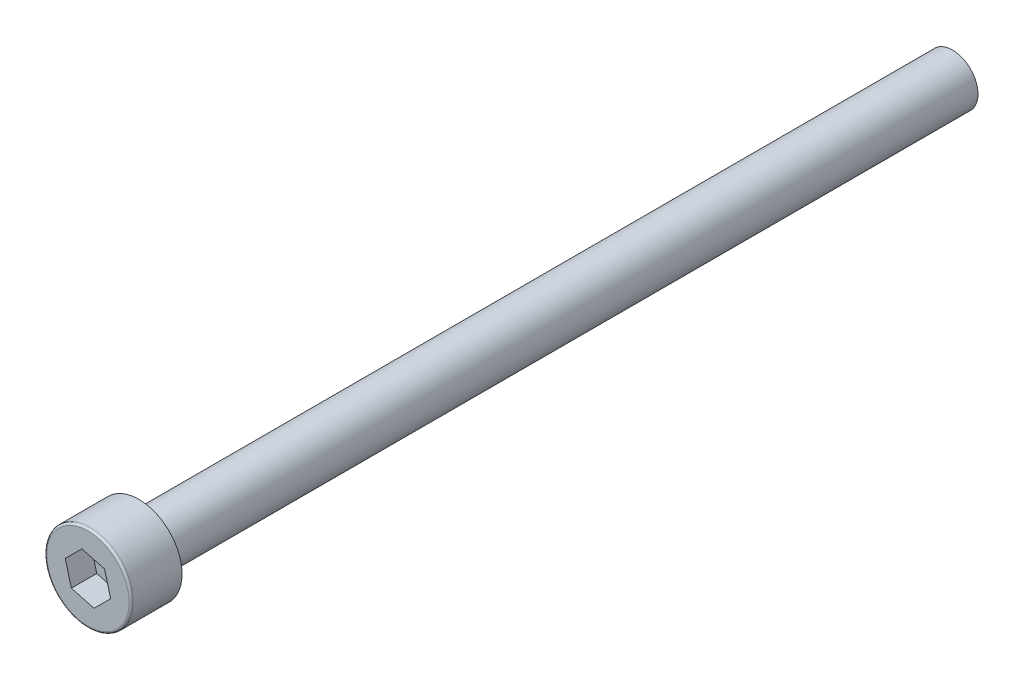
ISO-10303-21;
HEADER;
FILE_DESCRIPTION(('STEP AP214'),'2;1');
FILE_NAME('part.step','',(''),(''),'','','');
FILE_SCHEMA(('AUTOMOTIVE_DESIGN { 1 0 10303 214 1 1 1 1 }'));
ENDSEC;
DATA;
#1=APPLICATION_CONTEXT('core data for automotive mechanical design processes');
#2=APPLICATION_PROTOCOL_DEFINITION('international standard','automotive_design',2000,#1);
#3=PRODUCT_CONTEXT('',#1,'mechanical');
#4=PRODUCT('Part','Part','',(#3));
#5=PRODUCT_RELATED_PRODUCT_CATEGORY('part','',(#4));
#6=PRODUCT_DEFINITION_FORMATION('','',#4);
#7=PRODUCT_DEFINITION_CONTEXT('part definition',#1,'design');
#8=PRODUCT_DEFINITION('design','',#6,#7);
#9=PRODUCT_DEFINITION_SHAPE('','',#8);
#10=(LENGTH_UNIT() NAMED_UNIT(*) SI_UNIT(.MILLI.,.METRE.));
#11=(NAMED_UNIT(*) PLANE_ANGLE_UNIT() SI_UNIT($,.RADIAN.));
#12=(NAMED_UNIT(*) SI_UNIT($,.STERADIAN.) SOLID_ANGLE_UNIT());
#13=UNCERTAINTY_MEASURE_WITH_UNIT(LENGTH_MEASURE(1.E-05),#10,'distance_accuracy_value','');
#14=(GEOMETRIC_REPRESENTATION_CONTEXT(3) GLOBAL_UNCERTAINTY_ASSIGNED_CONTEXT((#13)) GLOBAL_UNIT_ASSIGNED_CONTEXT((#10,
#11,#12)) REPRESENTATION_CONTEXT('',''));
#15=CARTESIAN_POINT('',(0.,0.,0.));
#16=DIRECTION('',(0.,0.,1.));
#17=DIRECTION('',(1.,0.,0.));
#18=AXIS2_PLACEMENT_3D('',#15,#16,#17);
#19=CARTESIAN_POINT('',(0.,0.,0.));
#20=DIRECTION('',(0.,0.,1.));
#21=DIRECTION('',(1.,0.,0.));
#22=AXIS2_PLACEMENT_3D('',#19,#20,#21);
#23=PLANE('',#22);
#24=CARTESIAN_POINT('',(0.,0.,0.));
#25=DIRECTION('',(0.,0.,1.));
#26=DIRECTION('',(1.,0.,0.));
#27=AXIS2_PLACEMENT_3D('',#24,#25,#26);
#28=CIRCLE('',#27,4.25);
#29=CARTESIAN_POINT('',(4.25,0.,0.));
#30=VERTEX_POINT('',#29);
#31=EDGE_CURVE('E140',#30,#30,#28,.T.);
#32=ORIENTED_EDGE('',*,*,#31,.F.);
#33=EDGE_LOOP('',(#32));
#34=FACE_BOUND('',#33,.T.);
#35=CARTESIAN_POINT('',(0.,0.,0.));
#36=DIRECTION('',(0.,0.,1.));
#37=DIRECTION('',(1.,0.,0.));
#38=AXIS2_PLACEMENT_3D('',#35,#36,#37);
#39=CIRCLE('',#38,2.5);
#40=CARTESIAN_POINT('',(2.5,0.,0.));
#41=VERTEX_POINT('',#40);
#42=EDGE_CURVE('E148',#41,#41,#39,.F.);
#43=ORIENTED_EDGE('',*,*,#42,.F.);
#44=EDGE_LOOP('',(#43));
#45=FACE_BOUND('',#44,.T.);
#46=ADVANCED_FACE('F37',(#34,#45),#23,.F.);
#47=CARTESIAN_POINT('',(0.,0.,5.));
#48=DIRECTION('',(0.,0.,-1.));
#49=DIRECTION('',(-1.,0.,0.));
#50=AXIS2_PLACEMENT_3D('',#47,#48,#49);
#51=CYLINDRICAL_SURFACE('',#50,4.25);
#52=CARTESIAN_POINT('',(0.,0.,4.8));
#53=DIRECTION('',(0.,0.,1.));
#54=DIRECTION('',(1.,0.,0.));
#55=AXIS2_PLACEMENT_3D('',#52,#53,#54);
#56=CIRCLE('',#55,4.25);
#57=CARTESIAN_POINT('',(4.25,0.,4.8));
#58=VERTEX_POINT('',#57);
#59=EDGE_CURVE('E11',#58,#58,#56,.F.);
#60=ORIENTED_EDGE('',*,*,#59,.T.);
#61=EDGE_LOOP('',(#60));
#62=FACE_BOUND('',#61,.T.);
#63=ORIENTED_EDGE('',*,*,#31,.T.);
#64=EDGE_LOOP('',(#63));
#65=FACE_BOUND('',#64,.T.);
#66=ADVANCED_FACE('F167',(#62,#65),#51,.T.);
#67=CARTESIAN_POINT('',(0.,0.,5.));
#68=DIRECTION('',(0.,0.,1.));
#69=DIRECTION('',(1.,0.,0.));
#70=AXIS2_PLACEMENT_3D('',#67,#68,#69);
#71=PLANE('',#70);
#72=CARTESIAN_POINT('',(0.,0.,5.));
#73=DIRECTION('',(0.,0.,1.));
#74=DIRECTION('',(1.,0.,0.));
#75=AXIS2_PLACEMENT_3D('',#72,#73,#74);
#76=CIRCLE('',#75,4.05);
#77=CARTESIAN_POINT('',(4.05,0.,5.));
#78=VERTEX_POINT('',#77);
#79=EDGE_CURVE('E45',#78,#78,#76,.T.);
#80=ORIENTED_EDGE('',*,*,#79,.T.);
#81=EDGE_LOOP('',(#80));
#82=FACE_BOUND('',#81,.T.);
#83=DIRECTION('',(0.258819045102521,-0.965925826289068,0.));
#84=VECTOR('',#83,1.);
#85=CARTESIAN_POINT('',(-2.23071014330082,0.597716981445369,5.));
#86=LINE('',#85,#84);
#87=CARTESIAN_POINT('',(-2.23071014330082,0.597716981445369,5.));
#88=VERTEX_POINT('',#87);
#89=CARTESIAN_POINT('',(-1.63299316185545,-1.63299316185545,5.));
#90=VERTEX_POINT('',#89);
#91=EDGE_CURVE('E52',#88,#90,#86,.T.);
#92=ORIENTED_EDGE('',*,*,#91,.F.);
#93=DIRECTION('',(-0.707106781186547,-0.707106781186548,0.));
#94=VECTOR('',#93,1.);
#95=CARTESIAN_POINT('',(-0.597716981445369,2.23071014330082,5.));
#96=LINE('',#95,#94);
#97=CARTESIAN_POINT('',(-0.597716981445369,2.23071014330082,5.));
#98=VERTEX_POINT('',#97);
#99=EDGE_CURVE('E136',#98,#88,#96,.T.);
#100=ORIENTED_EDGE('',*,*,#99,.F.);
#101=DIRECTION('',(-0.965925826289068,0.258819045102521,0.));
#102=VECTOR('',#101,1.);
#103=CARTESIAN_POINT('',(1.63299316185545,1.63299316185545,5.));
#104=LINE('',#103,#102);
#105=CARTESIAN_POINT('',(1.63299316185545,1.63299316185545,5.));
#106=VERTEX_POINT('',#105);
#107=EDGE_CURVE('E134',#106,#98,#104,.T.);
#108=ORIENTED_EDGE('',*,*,#107,.F.);
#109=DIRECTION('',(-0.258819045102521,0.965925826289068,0.));
#110=VECTOR('',#109,1.);
#111=CARTESIAN_POINT('',(2.23071014330082,-0.597716981445369,5.));
#112=LINE('',#111,#110);
#113=CARTESIAN_POINT('',(2.23071014330082,-0.597716981445369,5.));
#114=VERTEX_POINT('',#113);
#115=EDGE_CURVE('E100',#114,#106,#112,.T.);
#116=ORIENTED_EDGE('',*,*,#115,.F.);
#117=DIRECTION('',(0.707106781186547,0.707106781186547,0.));
#118=VECTOR('',#117,1.);
#119=CARTESIAN_POINT('',(0.597716981445369,-2.23071014330082,5.));
#120=LINE('',#119,#118);
#121=CARTESIAN_POINT('',(0.597716981445369,-2.23071014330082,5.));
#122=VERTEX_POINT('',#121);
#123=EDGE_CURVE('E130',#122,#114,#120,.T.);
#124=ORIENTED_EDGE('',*,*,#123,.F.);
#125=DIRECTION('',(0.965925826289068,-0.258819045102521,0.));
#126=VECTOR('',#125,1.);
#127=CARTESIAN_POINT('',(-1.63299316185545,-1.63299316185545,5.));
#128=LINE('',#127,#126);
#129=EDGE_CURVE('E126',#90,#122,#128,.T.);
#130=ORIENTED_EDGE('',*,*,#129,.F.);
#131=EDGE_LOOP('',(#92,#100,#108,#116,#124,#130));
#132=FACE_BOUND('',#131,.T.);
#133=ADVANCED_FACE('F153',(#82,#132),#71,.T.);
#134=CARTESIAN_POINT('',(-2.23071014330082,0.597716981445369,2.5));
#135=DIRECTION('',(-0.965925826289068,-0.258819045102521,0.));
#136=DIRECTION('',(0.258819045102521,-0.965925826289068,0.));
#137=AXIS2_PLACEMENT_3D('',#134,#135,#136);
#138=PLANE('',#137);
#139=ORIENTED_EDGE('',*,*,#91,.T.);
#140=DIRECTION('',(0.,0.,1.));
#141=VECTOR('',#140,1.);
#142=CARTESIAN_POINT('',(-1.63299316185545,-1.63299316185545,2.5));
#143=LINE('',#142,#141);
#144=CARTESIAN_POINT('',(-1.63299316185545,-1.63299316185545,2.5));
#145=VERTEX_POINT('',#144);
#146=EDGE_CURVE('E82',#145,#90,#143,.T.);
#147=ORIENTED_EDGE('',*,*,#146,.F.);
#148=DIRECTION('',(0.258819045102521,-0.965925826289068,0.));
#149=VECTOR('',#148,1.);
#150=CARTESIAN_POINT('',(-2.23071014330082,0.597716981445369,2.5));
#151=LINE('',#150,#149);
#152=CARTESIAN_POINT('',(-2.23071014330082,0.597716981445369,2.5));
#153=VERTEX_POINT('',#152);
#154=EDGE_CURVE('E138',#153,#145,#151,.T.);
#155=ORIENTED_EDGE('',*,*,#154,.F.);
#156=DIRECTION('',(0.,0.,1.));
#157=VECTOR('',#156,1.);
#158=CARTESIAN_POINT('',(-2.23071014330082,0.597716981445369,2.5));
#159=LINE('',#158,#157);
#160=EDGE_CURVE('E60',#153,#88,#159,.T.);
#161=ORIENTED_EDGE('',*,*,#160,.T.);
#162=EDGE_LOOP('',(#139,#147,#155,#161));
#163=FACE_BOUND('',#162,.T.);
#164=ADVANCED_FACE('F179',(#163),#138,.F.);
#165=CARTESIAN_POINT('',(-0.597716981445369,2.23071014330082,2.5));
#166=DIRECTION('',(-0.707106781186548,0.707106781186547,0.));
#167=DIRECTION('',(-0.707106781186547,-0.707106781186548,0.));
#168=AXIS2_PLACEMENT_3D('',#165,#166,#167);
#169=PLANE('',#168);
#170=ORIENTED_EDGE('',*,*,#99,.T.);
#171=ORIENTED_EDGE('',*,*,#160,.F.);
#172=DIRECTION('',(-0.707106781186547,-0.707106781186548,0.));
#173=VECTOR('',#172,1.);
#174=CARTESIAN_POINT('',(-0.597716981445369,2.23071014330082,2.5));
#175=LINE('',#174,#173);
#176=CARTESIAN_POINT('',(-0.597716981445369,2.23071014330082,2.5));
#177=VERTEX_POINT('',#176);
#178=EDGE_CURVE('E112',#177,#153,#175,.T.);
#179=ORIENTED_EDGE('',*,*,#178,.F.);
#180=DIRECTION('',(0.,0.,1.));
#181=VECTOR('',#180,1.);
#182=CARTESIAN_POINT('',(-0.597716981445369,2.23071014330082,2.5));
#183=LINE('',#182,#181);
#184=EDGE_CURVE('E104',#177,#98,#183,.T.);
#185=ORIENTED_EDGE('',*,*,#184,.T.);
#186=EDGE_LOOP('',(#170,#171,#179,#185));
#187=FACE_BOUND('',#186,.T.);
#188=ADVANCED_FACE('F182',(#187),#169,.F.);
#189=CARTESIAN_POINT('',(1.63299316185545,1.63299316185545,2.5));
#190=DIRECTION('',(0.258819045102521,0.965925826289068,0.));
#191=DIRECTION('',(-0.965925826289068,0.258819045102521,0.));
#192=AXIS2_PLACEMENT_3D('',#189,#190,#191);
#193=PLANE('',#192);
#194=ORIENTED_EDGE('',*,*,#107,.T.);
#195=ORIENTED_EDGE('',*,*,#184,.F.);
#196=DIRECTION('',(-0.965925826289068,0.258819045102521,0.));
#197=VECTOR('',#196,1.);
#198=CARTESIAN_POINT('',(1.63299316185545,1.63299316185545,2.5));
#199=LINE('',#198,#197);
#200=CARTESIAN_POINT('',(1.63299316185545,1.63299316185545,2.5));
#201=VERTEX_POINT('',#200);
#202=EDGE_CURVE('E108',#201,#177,#199,.T.);
#203=ORIENTED_EDGE('',*,*,#202,.F.);
#204=DIRECTION('',(0.,0.,1.));
#205=VECTOR('',#204,1.);
#206=CARTESIAN_POINT('',(1.63299316185545,1.63299316185545,2.5));
#207=LINE('',#206,#205);
#208=EDGE_CURVE('E93',#201,#106,#207,.T.);
#209=ORIENTED_EDGE('',*,*,#208,.T.);
#210=EDGE_LOOP('',(#194,#195,#203,#209));
#211=FACE_BOUND('',#210,.T.);
#212=ADVANCED_FACE('F109',(#211),#193,.F.);
#213=CARTESIAN_POINT('',(2.23071014330082,-0.597716981445369,2.5));
#214=DIRECTION('',(0.965925826289068,0.258819045102521,0.));
#215=DIRECTION('',(-0.258819045102521,0.965925826289068,0.));
#216=AXIS2_PLACEMENT_3D('',#213,#214,#215);
#217=PLANE('',#216);
#218=ORIENTED_EDGE('',*,*,#115,.T.);
#219=ORIENTED_EDGE('',*,*,#208,.F.);
#220=DIRECTION('',(-0.258819045102521,0.965925826289068,0.));
#221=VECTOR('',#220,1.);
#222=CARTESIAN_POINT('',(2.23071014330082,-0.597716981445369,2.5));
#223=LINE('',#222,#221);
#224=CARTESIAN_POINT('',(2.23071014330082,-0.597716981445369,2.5));
#225=VERTEX_POINT('',#224);
#226=EDGE_CURVE('E97',#225,#201,#223,.T.);
#227=ORIENTED_EDGE('',*,*,#226,.F.);
#228=DIRECTION('',(0.,0.,1.));
#229=VECTOR('',#228,1.);
#230=CARTESIAN_POINT('',(2.23071014330082,-0.597716981445369,2.5));
#231=LINE('',#230,#229);
#232=EDGE_CURVE('E105',#225,#114,#231,.T.);
#233=ORIENTED_EDGE('',*,*,#232,.T.);
#234=EDGE_LOOP('',(#218,#219,#227,#233));
#235=FACE_BOUND('',#234,.T.);
#236=ADVANCED_FACE('F95',(#235),#217,.F.);
#237=CARTESIAN_POINT('',(0.597716981445369,-2.23071014330082,2.5));
#238=DIRECTION('',(0.707106781186548,-0.707106781186548,0.));
#239=DIRECTION('',(0.707106781186548,0.707106781186548,0.));
#240=AXIS2_PLACEMENT_3D('',#237,#238,#239);
#241=PLANE('',#240);
#242=ORIENTED_EDGE('',*,*,#123,.T.);
#243=ORIENTED_EDGE('',*,*,#232,.F.);
#244=DIRECTION('',(0.707106781186547,0.707106781186547,0.));
#245=VECTOR('',#244,1.);
#246=CARTESIAN_POINT('',(0.597716981445369,-2.23071014330082,2.5));
#247=LINE('',#246,#245);
#248=CARTESIAN_POINT('',(0.597716981445369,-2.23071014330082,2.5));
#249=VERTEX_POINT('',#248);
#250=EDGE_CURVE('E118',#249,#225,#247,.T.);
#251=ORIENTED_EDGE('',*,*,#250,.F.);
#252=DIRECTION('',(0.,0.,1.));
#253=VECTOR('',#252,1.);
#254=CARTESIAN_POINT('',(0.597716981445369,-2.23071014330082,2.5));
#255=LINE('',#254,#253);
#256=EDGE_CURVE('E143',#249,#122,#255,.T.);
#257=ORIENTED_EDGE('',*,*,#256,.T.);
#258=EDGE_LOOP('',(#242,#243,#251,#257));
#259=FACE_BOUND('',#258,.T.);
#260=ADVANCED_FACE('F186',(#259),#241,.F.);
#261=CARTESIAN_POINT('',(-1.63299316185545,-1.63299316185545,2.5));
#262=DIRECTION('',(-0.258819045102521,-0.965925826289068,0.));
#263=DIRECTION('',(0.965925826289068,-0.258819045102521,0.));
#264=AXIS2_PLACEMENT_3D('',#261,#262,#263);
#265=PLANE('',#264);
#266=ORIENTED_EDGE('',*,*,#129,.T.);
#267=ORIENTED_EDGE('',*,*,#256,.F.);
#268=DIRECTION('',(0.965925826289068,-0.258819045102521,0.));
#269=VECTOR('',#268,1.);
#270=CARTESIAN_POINT('',(-1.63299316185545,-1.63299316185545,2.5));
#271=LINE('',#270,#269);
#272=EDGE_CURVE('E120',#145,#249,#271,.T.);
#273=ORIENTED_EDGE('',*,*,#272,.F.);
#274=ORIENTED_EDGE('',*,*,#146,.T.);
#275=EDGE_LOOP('',(#266,#267,#273,#274));
#276=FACE_BOUND('',#275,.T.);
#277=ADVANCED_FACE('F183',(#276),#265,.F.);
#278=CARTESIAN_POINT('',(0.,0.,2.5));
#279=DIRECTION('',(0.,0.,1.));
#280=DIRECTION('',(1.,0.,0.));
#281=AXIS2_PLACEMENT_3D('',#278,#279,#280);
#282=PLANE('',#281);
#283=ORIENTED_EDGE('',*,*,#154,.T.);
#284=ORIENTED_EDGE('',*,*,#272,.T.);
#285=ORIENTED_EDGE('',*,*,#250,.T.);
#286=ORIENTED_EDGE('',*,*,#226,.T.);
#287=ORIENTED_EDGE('',*,*,#202,.T.);
#288=ORIENTED_EDGE('',*,*,#178,.T.);
#289=EDGE_LOOP('',(#283,#284,#285,#286,#287,#288));
#290=FACE_BOUND('',#289,.T.);
#291=ADVANCED_FACE('F115',(#290),#282,.T.);
#292=CARTESIAN_POINT('',(0.,0.,-80.));
#293=DIRECTION('',(0.,0.,1.));
#294=DIRECTION('',(1.,0.,0.));
#295=AXIS2_PLACEMENT_3D('',#292,#293,#294);
#296=CYLINDRICAL_SURFACE('',#295,2.5);
#297=CARTESIAN_POINT('',(0.,0.,-80.));
#298=DIRECTION('',(0.,0.,-1.));
#299=DIRECTION('',(-1.,0.,0.));
#300=AXIS2_PLACEMENT_3D('',#297,#298,#299);
#301=CIRCLE('',#300,2.5);
#302=CARTESIAN_POINT('',(-2.5,0.,-80.));
#303=VERTEX_POINT('',#302);
#304=EDGE_CURVE('E127',#303,#303,#301,.T.);
#305=ORIENTED_EDGE('',*,*,#304,.F.);
#306=EDGE_LOOP('',(#305));
#307=FACE_BOUND('',#306,.T.);
#308=ORIENTED_EDGE('',*,*,#42,.T.);
#309=EDGE_LOOP('',(#308));
#310=FACE_BOUND('',#309,.T.);
#311=ADVANCED_FACE('F162',(#307,#310),#296,.T.);
#312=CARTESIAN_POINT('',(0.,0.,-80.));
#313=DIRECTION('',(0.,0.,-1.));
#314=DIRECTION('',(-1.,0.,0.));
#315=AXIS2_PLACEMENT_3D('',#312,#313,#314);
#316=PLANE('',#315);
#317=ORIENTED_EDGE('',*,*,#304,.T.);
#318=EDGE_LOOP('',(#317));
#319=FACE_BOUND('',#318,.T.);
#320=ADVANCED_FACE('F157',(#319),#316,.T.);
#321=CARTESIAN_POINT('',(0.,0.,4.8));
#322=DIRECTION('',(0.,0.,1.));
#323=DIRECTION('',(1.,0.,0.));
#324=AXIS2_PLACEMENT_3D('',#321,#322,#323);
#325=TOROIDAL_SURFACE('',#324,4.05,0.2);
#326=ORIENTED_EDGE('',*,*,#59,.F.);
#327=EDGE_LOOP('',(#326));
#328=FACE_BOUND('',#327,.T.);
#329=ORIENTED_EDGE('',*,*,#79,.F.);
#330=EDGE_LOOP('',(#329));
#331=FACE_BOUND('',#330,.T.);
#332=ADVANCED_FACE('F39',(#328,#331),#325,.T.);
#333=CLOSED_SHELL('',(#46,#66,#133,#164,#188,#212,#236,#260,#277,#291,#311,#320,#332));
#334=MANIFOLD_SOLID_BREP('B2',#333);
#335=ADVANCED_BREP_SHAPE_REPRESENTATION('',(#18,#334),#14);
#336=SHAPE_DEFINITION_REPRESENTATION(#9,#335);
ENDSEC;
END-ISO-10303-21;
